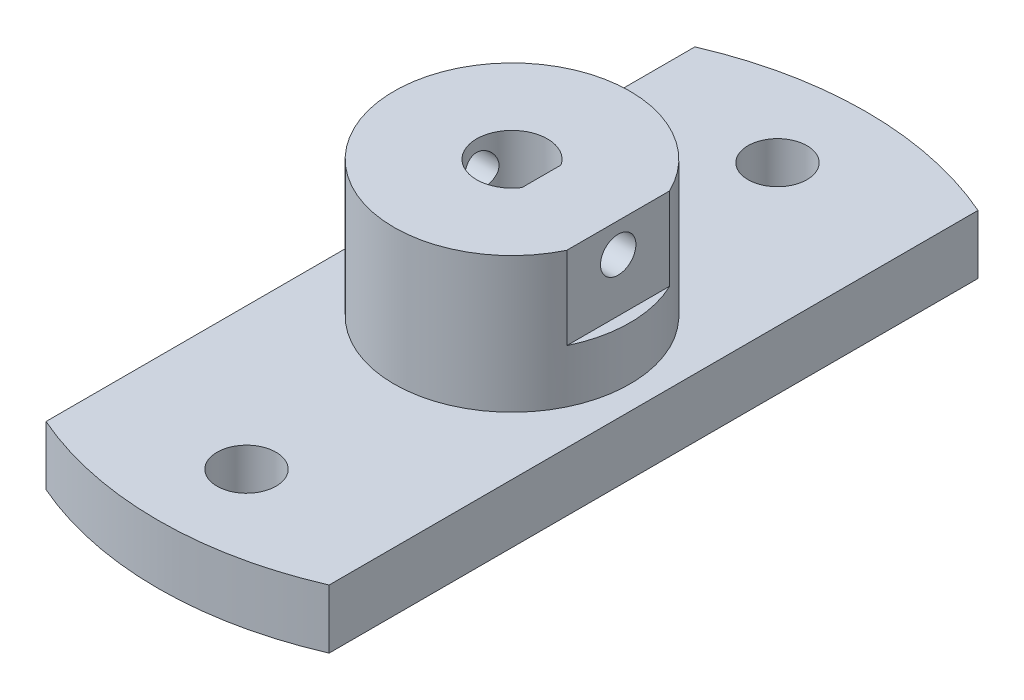
ISO-10303-21;
HEADER;
FILE_DESCRIPTION(('STEP AP214'),'2;1');
FILE_NAME('part.step','',(''),(''),'','','');
FILE_SCHEMA(('AUTOMOTIVE_DESIGN { 1 0 10303 214 1 1 1 1 }'));
ENDSEC;
DATA;
#1=APPLICATION_CONTEXT('core data for automotive mechanical design processes');
#2=APPLICATION_PROTOCOL_DEFINITION('international standard','automotive_design',2000,#1);
#3=PRODUCT_CONTEXT('',#1,'mechanical');
#4=PRODUCT('Part','Part','',(#3));
#5=PRODUCT_RELATED_PRODUCT_CATEGORY('part','',(#4));
#6=PRODUCT_DEFINITION_FORMATION('','',#4);
#7=PRODUCT_DEFINITION_CONTEXT('part definition',#1,'design');
#8=PRODUCT_DEFINITION('design','',#6,#7);
#9=PRODUCT_DEFINITION_SHAPE('','',#8);
#10=(LENGTH_UNIT() NAMED_UNIT(*) SI_UNIT(.MILLI.,.METRE.));
#11=(NAMED_UNIT(*) PLANE_ANGLE_UNIT() SI_UNIT($,.RADIAN.));
#12=(NAMED_UNIT(*) SI_UNIT($,.STERADIAN.) SOLID_ANGLE_UNIT());
#13=UNCERTAINTY_MEASURE_WITH_UNIT(LENGTH_MEASURE(1.E-05),#10,'distance_accuracy_value','');
#14=(GEOMETRIC_REPRESENTATION_CONTEXT(3) GLOBAL_UNCERTAINTY_ASSIGNED_CONTEXT((#13)) GLOBAL_UNIT_ASSIGNED_CONTEXT((#10,
#11,#12)) REPRESENTATION_CONTEXT('',''));
#15=CARTESIAN_POINT('',(0.,0.,0.));
#16=DIRECTION('',(0.,0.,1.));
#17=DIRECTION('',(1.,0.,0.));
#18=AXIS2_PLACEMENT_3D('',#15,#16,#17);
#19=CARTESIAN_POINT('',(0.,5.,0.));
#20=DIRECTION('',(0.,1.,0.));
#21=DIRECTION('',(0.,0.,1.));
#22=AXIS2_PLACEMENT_3D('',#19,#20,#21);
#23=PLANE('',#22);
#24=CARTESIAN_POINT('',(0.,5.,0.));
#25=DIRECTION('',(0.,1.,0.));
#26=DIRECTION('',(0.,0.,1.));
#27=AXIS2_PLACEMENT_3D('',#24,#25,#26);
#28=CIRCLE('',#27,10.);
#29=CARTESIAN_POINT('',(0.,5.,10.));
#30=VERTEX_POINT('',#29);
#31=EDGE_CURVE('E136',#30,#30,#28,.T.);
#32=ORIENTED_EDGE('',*,*,#31,.F.);
#33=EDGE_LOOP('',(#32));
#34=FACE_BOUND('',#33,.T.);
#35=CARTESIAN_POINT('',(0.,5.,-22.5));
#36=DIRECTION('',(0.,1.,0.));
#37=DIRECTION('',(0.,0.,1.));
#38=AXIS2_PLACEMENT_3D('',#35,#36,#37);
#39=CIRCLE('',#38,2.5);
#40=CARTESIAN_POINT('',(0.,5.,-20.));
#41=VERTEX_POINT('',#40);
#42=EDGE_CURVE('E150',#41,#41,#39,.T.);
#43=ORIENTED_EDGE('',*,*,#42,.F.);
#44=EDGE_LOOP('',(#43));
#45=FACE_BOUND('',#44,.T.);
#46=CARTESIAN_POINT('',(0.,5.,0.));
#47=DIRECTION('',(0.,1.,0.));
#48=DIRECTION('',(0.,0.,1.));
#49=AXIS2_PLACEMENT_3D('',#46,#47,#48);
#50=CIRCLE('',#49,30.);
#51=CARTESIAN_POINT('',(-12.,5.,27.495454169735));
#52=VERTEX_POINT('',#51);
#53=CARTESIAN_POINT('',(12.,5.,27.495454169735));
#54=VERTEX_POINT('',#53);
#55=EDGE_CURVE('E156',#52,#54,#50,.T.);
#56=ORIENTED_EDGE('',*,*,#55,.T.);
#57=DIRECTION('',(0.,0.,-1.));
#58=VECTOR('',#57,1.);
#59=CARTESIAN_POINT('',(12.,5.,-27.495454169735));
#60=LINE('',#59,#58);
#61=CARTESIAN_POINT('',(12.,5.,-27.495454169735));
#62=VERTEX_POINT('',#61);
#63=EDGE_CURVE('E159',#54,#62,#60,.T.);
#64=ORIENTED_EDGE('',*,*,#63,.T.);
#65=CARTESIAN_POINT('',(0.,5.,0.));
#66=DIRECTION('',(0.,1.,0.));
#67=DIRECTION('',(0.,0.,1.));
#68=AXIS2_PLACEMENT_3D('',#65,#66,#67);
#69=CIRCLE('',#68,30.);
#70=CARTESIAN_POINT('',(-12.,5.,-27.495454169735));
#71=VERTEX_POINT('',#70);
#72=EDGE_CURVE('E162',#62,#71,#69,.T.);
#73=ORIENTED_EDGE('',*,*,#72,.T.);
#74=DIRECTION('',(0.,0.,1.));
#75=VECTOR('',#74,1.);
#76=CARTESIAN_POINT('',(-12.,5.,-27.495454169735));
#77=LINE('',#76,#75);
#78=EDGE_CURVE('E164',#71,#52,#77,.T.);
#79=ORIENTED_EDGE('',*,*,#78,.T.);
#80=EDGE_LOOP('',(#56,#64,#73,#79));
#81=FACE_BOUND('',#80,.T.);
#82=CARTESIAN_POINT('',(0.,5.,22.5));
#83=DIRECTION('',(0.,1.,0.));
#84=DIRECTION('',(0.,0.,1.));
#85=AXIS2_PLACEMENT_3D('',#82,#83,#84);
#86=CIRCLE('',#85,2.5);
#87=CARTESIAN_POINT('',(0.,5.,25.));
#88=VERTEX_POINT('',#87);
#89=EDGE_CURVE('E144',#88,#88,#86,.T.);
#90=ORIENTED_EDGE('',*,*,#89,.F.);
#91=EDGE_LOOP('',(#90));
#92=FACE_BOUND('',#91,.T.);
#93=ADVANCED_FACE('F35',(#34,#45,#81,#92),#23,.T.);
#94=CARTESIAN_POINT('',(0.,0.,0.));
#95=DIRECTION('',(0.,1.,0.));
#96=DIRECTION('',(0.,0.,1.));
#97=AXIS2_PLACEMENT_3D('',#94,#95,#96);
#98=PLANE('',#97);
#99=CARTESIAN_POINT('',(0.,0.,0.));
#100=DIRECTION('',(0.,1.,0.));
#101=DIRECTION('',(0.,0.,1.));
#102=AXIS2_PLACEMENT_3D('',#99,#100,#101);
#103=CIRCLE('',#102,3.);
#104=CARTESIAN_POINT('',(0.,0.,3.));
#105=VERTEX_POINT('',#104);
#106=EDGE_CURVE('E116',#105,#105,#103,.T.);
#107=ORIENTED_EDGE('',*,*,#106,.T.);
#108=EDGE_LOOP('',(#107));
#109=FACE_BOUND('',#108,.T.);
#110=CARTESIAN_POINT('',(0.,0.,0.));
#111=DIRECTION('',(0.,1.,0.));
#112=DIRECTION('',(0.,0.,1.));
#113=AXIS2_PLACEMENT_3D('',#110,#111,#112);
#114=CIRCLE('',#113,30.);
#115=CARTESIAN_POINT('',(-12.,0.,27.495454169735));
#116=VERTEX_POINT('',#115);
#117=CARTESIAN_POINT('',(12.,0.,27.495454169735));
#118=VERTEX_POINT('',#117);
#119=EDGE_CURVE('E153',#116,#118,#114,.T.);
#120=ORIENTED_EDGE('',*,*,#119,.F.);
#121=DIRECTION('',(0.,0.,1.));
#122=VECTOR('',#121,1.);
#123=CARTESIAN_POINT('',(-12.,0.,-27.495454169735));
#124=LINE('',#123,#122);
#125=CARTESIAN_POINT('',(-12.,0.,-27.495454169735));
#126=VERTEX_POINT('',#125);
#127=EDGE_CURVE('E160',#126,#116,#124,.T.);
#128=ORIENTED_EDGE('',*,*,#127,.F.);
#129=CARTESIAN_POINT('',(0.,0.,0.));
#130=DIRECTION('',(0.,1.,0.));
#131=DIRECTION('',(0.,0.,1.));
#132=AXIS2_PLACEMENT_3D('',#129,#130,#131);
#133=CIRCLE('',#132,30.);
#134=CARTESIAN_POINT('',(12.,0.,-27.495454169735));
#135=VERTEX_POINT('',#134);
#136=EDGE_CURVE('E171',#135,#126,#133,.T.);
#137=ORIENTED_EDGE('',*,*,#136,.F.);
#138=DIRECTION('',(0.,0.,-1.));
#139=VECTOR('',#138,1.);
#140=CARTESIAN_POINT('',(12.,0.,-27.495454169735));
#141=LINE('',#140,#139);
#142=EDGE_CURVE('E169',#118,#135,#141,.T.);
#143=ORIENTED_EDGE('',*,*,#142,.F.);
#144=EDGE_LOOP('',(#120,#128,#137,#143));
#145=FACE_BOUND('',#144,.T.);
#146=CARTESIAN_POINT('',(0.,0.,-22.5));
#147=DIRECTION('',(0.,1.,0.));
#148=DIRECTION('',(0.,0.,1.));
#149=AXIS2_PLACEMENT_3D('',#146,#147,#148);
#150=CIRCLE('',#149,2.5);
#151=CARTESIAN_POINT('',(0.,0.,-20.));
#152=VERTEX_POINT('',#151);
#153=EDGE_CURVE('E147',#152,#152,#150,.T.);
#154=ORIENTED_EDGE('',*,*,#153,.T.);
#155=EDGE_LOOP('',(#154));
#156=FACE_BOUND('',#155,.T.);
#157=CARTESIAN_POINT('',(0.,0.,22.5));
#158=DIRECTION('',(0.,1.,0.));
#159=DIRECTION('',(0.,0.,1.));
#160=AXIS2_PLACEMENT_3D('',#157,#158,#159);
#161=CIRCLE('',#160,2.5);
#162=CARTESIAN_POINT('',(0.,0.,25.));
#163=VERTEX_POINT('',#162);
#164=EDGE_CURVE('E141',#163,#163,#161,.T.);
#165=ORIENTED_EDGE('',*,*,#164,.T.);
#166=EDGE_LOOP('',(#165));
#167=FACE_BOUND('',#166,.T.);
#168=ADVANCED_FACE('F233',(#109,#145,#156,#167),#98,.F.);
#169=CARTESIAN_POINT('',(0.,5.,0.));
#170=DIRECTION('',(0.,-1.,0.));
#171=DIRECTION('',(0.,0.,-1.));
#172=AXIS2_PLACEMENT_3D('',#169,#170,#171);
#173=CYLINDRICAL_SURFACE('',#172,30.);
#174=ORIENTED_EDGE('',*,*,#119,.T.);
#175=DIRECTION('',(0.,-1.,0.));
#176=VECTOR('',#175,1.);
#177=CARTESIAN_POINT('',(12.,5.,27.495454169735));
#178=LINE('',#177,#176);
#179=EDGE_CURVE('E11',#54,#118,#178,.T.);
#180=ORIENTED_EDGE('',*,*,#179,.F.);
#181=ORIENTED_EDGE('',*,*,#55,.F.);
#182=DIRECTION('',(0.,-1.,0.));
#183=VECTOR('',#182,1.);
#184=CARTESIAN_POINT('',(-12.,5.,27.495454169735));
#185=LINE('',#184,#183);
#186=EDGE_CURVE('E166',#52,#116,#185,.T.);
#187=ORIENTED_EDGE('',*,*,#186,.T.);
#188=EDGE_LOOP('',(#174,#180,#181,#187));
#189=FACE_BOUND('',#188,.T.);
#190=ADVANCED_FACE('F37',(#189),#173,.T.);
#191=CARTESIAN_POINT('',(12.,5.,-27.495454169735));
#192=DIRECTION('',(-1.,0.,0.));
#193=DIRECTION('',(0.,0.,1.));
#194=AXIS2_PLACEMENT_3D('',#191,#192,#193);
#195=PLANE('',#194);
#196=ORIENTED_EDGE('',*,*,#142,.T.);
#197=DIRECTION('',(0.,-1.,0.));
#198=VECTOR('',#197,1.);
#199=CARTESIAN_POINT('',(12.,5.,-27.495454169735));
#200=LINE('',#199,#198);
#201=EDGE_CURVE('E44',#62,#135,#200,.T.);
#202=ORIENTED_EDGE('',*,*,#201,.F.);
#203=ORIENTED_EDGE('',*,*,#63,.F.);
#204=ORIENTED_EDGE('',*,*,#179,.T.);
#205=EDGE_LOOP('',(#196,#202,#203,#204));
#206=FACE_BOUND('',#205,.T.);
#207=ADVANCED_FACE('F251',(#206),#195,.F.);
#208=CARTESIAN_POINT('',(0.,5.,0.));
#209=DIRECTION('',(0.,-1.,0.));
#210=DIRECTION('',(0.,0.,-1.));
#211=AXIS2_PLACEMENT_3D('',#208,#209,#210);
#212=CYLINDRICAL_SURFACE('',#211,30.);
#213=ORIENTED_EDGE('',*,*,#136,.T.);
#214=DIRECTION('',(0.,-1.,0.));
#215=VECTOR('',#214,1.);
#216=CARTESIAN_POINT('',(-12.,5.,-27.495454169735));
#217=LINE('',#216,#215);
#218=EDGE_CURVE('E176',#71,#126,#217,.T.);
#219=ORIENTED_EDGE('',*,*,#218,.F.);
#220=ORIENTED_EDGE('',*,*,#72,.F.);
#221=ORIENTED_EDGE('',*,*,#201,.T.);
#222=EDGE_LOOP('',(#213,#219,#220,#221));
#223=FACE_BOUND('',#222,.T.);
#224=ADVANCED_FACE('F248',(#223),#212,.T.);
#225=CARTESIAN_POINT('',(-12.,5.,-27.495454169735));
#226=DIRECTION('',(1.,0.,0.));
#227=DIRECTION('',(0.,0.,-1.));
#228=AXIS2_PLACEMENT_3D('',#225,#226,#227);
#229=PLANE('',#228);
#230=ORIENTED_EDGE('',*,*,#127,.T.);
#231=ORIENTED_EDGE('',*,*,#186,.F.);
#232=ORIENTED_EDGE('',*,*,#78,.F.);
#233=ORIENTED_EDGE('',*,*,#218,.T.);
#234=EDGE_LOOP('',(#230,#231,#232,#233));
#235=FACE_BOUND('',#234,.T.);
#236=ADVANCED_FACE('F245',(#235),#229,.F.);
#237=CARTESIAN_POINT('',(0.,5.,-22.5));
#238=DIRECTION('',(0.,-1.,0.));
#239=DIRECTION('',(0.,0.,-1.));
#240=AXIS2_PLACEMENT_3D('',#237,#238,#239);
#241=CYLINDRICAL_SURFACE('',#240,2.5);
#242=ORIENTED_EDGE('',*,*,#42,.T.);
#243=EDGE_LOOP('',(#242));
#244=FACE_BOUND('',#243,.T.);
#245=ORIENTED_EDGE('',*,*,#153,.F.);
#246=EDGE_LOOP('',(#245));
#247=FACE_BOUND('',#246,.T.);
#248=ADVANCED_FACE('F243',(#244,#247),#241,.F.);
#249=CARTESIAN_POINT('',(0.,5.,22.5));
#250=DIRECTION('',(0.,-1.,0.));
#251=DIRECTION('',(0.,0.,-1.));
#252=AXIS2_PLACEMENT_3D('',#249,#250,#251);
#253=CYLINDRICAL_SURFACE('',#252,2.5);
#254=ORIENTED_EDGE('',*,*,#89,.T.);
#255=EDGE_LOOP('',(#254));
#256=FACE_BOUND('',#255,.T.);
#257=ORIENTED_EDGE('',*,*,#164,.F.);
#258=EDGE_LOOP('',(#257));
#259=FACE_BOUND('',#258,.T.);
#260=ADVANCED_FACE('F229',(#256,#259),#253,.F.);
#261=CARTESIAN_POINT('',(0.,16.5,0.));
#262=DIRECTION('',(0.,-1.,0.));
#263=DIRECTION('',(0.,0.,-1.));
#264=AXIS2_PLACEMENT_3D('',#261,#262,#263);
#265=CYLINDRICAL_SURFACE('',#264,10.);
#266=CARTESIAN_POINT('',(-9.88685996664259,14.,-1.5));
#267=CARTESIAN_POINT('',(-9.88686136668593,14.08374556929,-1.49999654107284));
#268=CARTESIAN_POINT('',(-9.88793551739101,14.1675397507507,-1.49296296388491));
#269=CARTESIAN_POINT('',(-9.8921131480324,14.3327853148831,-1.46502196657001));
#270=CARTESIAN_POINT('',(-9.8952186073143,14.41423433148,-1.44410101402628));
#271=CARTESIAN_POINT('',(-9.90309938986228,14.5723737554469,-1.38902526098084));
#272=CARTESIAN_POINT('',(-9.90787343131536,14.6490677625422,-1.35488061681397));
#273=CARTESIAN_POINT('',(-9.91855194113145,14.7956270307721,-1.27435063087791));
#274=CARTESIAN_POINT('',(-9.92445625383668,14.8654932302143,-1.22796697429872));
#275=CARTESIAN_POINT('',(-9.9367828924804,14.9969838167543,-1.12387902418559));
#276=CARTESIAN_POINT('',(-9.94320862458057,15.0585456134067,-1.0660960558482));
#277=CARTESIAN_POINT('',(-9.95582368169047,15.1711374856555,-0.941019605444376));
#278=CARTESIAN_POINT('',(-9.96201299368615,15.222166982167,-0.873725600786531));
#279=CARTESIAN_POINT('',(-9.97349347428185,15.3124766316914,-0.731136358052746));
#280=CARTESIAN_POINT('',(-9.97878018435569,15.3516991503225,-0.655804227365768));
#281=CARTESIAN_POINT('',(-9.98782206746405,15.4169115988082,-0.499528850106976));
#282=CARTESIAN_POINT('',(-9.99157732141945,15.4429022278429,-0.418585900270678));
#283=CARTESIAN_POINT('',(-9.99710914797782,15.4807233885308,-0.254031123090571));
#284=CARTESIAN_POINT('',(-9.99890035887344,15.4926587263872,-0.170443884389868));
#285=CARTESIAN_POINT('',(-10.0003524476958,15.5023559348249,-0.00243520401948052));
#286=CARTESIAN_POINT('',(-10.0000134440494,15.5001185933197,0.0819861910157448));
#287=CARTESIAN_POINT('',(-9.99725499660796,15.4816166622376,0.248551718200518));
#288=CARTESIAN_POINT('',(-9.99485227652479,15.4654648282085,0.330708691400006));
#289=CARTESIAN_POINT('',(-9.98825500227851,15.4197693936774,0.491132829143136));
#290=CARTESIAN_POINT('',(-9.98406040199739,15.3902254484986,0.56939989351348));
#291=CARTESIAN_POINT('',(-9.97432193873206,15.3184690030829,0.720163780770315));
#292=CARTESIAN_POINT('',(-9.96877303515638,15.2762090348913,0.792637672323595));
#293=CARTESIAN_POINT('',(-9.95694438245421,15.18025480633,0.929507907150176));
#294=CARTESIAN_POINT('',(-9.95066458523184,15.1265597932931,0.993903718271734));
#295=CARTESIAN_POINT('',(-9.93800158192627,15.0086315511734,1.11345448272264));
#296=CARTESIAN_POINT('',(-9.93161796623257,14.9442998780299,1.16851232950947));
#297=CARTESIAN_POINT('',(-9.91952704453523,14.8072589228763,1.26706599338813));
#298=CARTESIAN_POINT('',(-9.91381974269649,14.7345495892801,1.31056173927999));
#299=CARTESIAN_POINT('',(-9.90372775286855,14.5827160370594,1.38476964534605));
#300=CARTESIAN_POINT('',(-9.89934409845291,14.5035868663376,1.41547182270081));
#301=CARTESIAN_POINT('',(-9.89241402899059,14.3412147448526,1.46312336208879));
#302=CARTESIAN_POINT('',(-9.88986748446299,14.2579720844532,1.48007369337326));
#303=CARTESIAN_POINT('',(-9.88692451395027,14.0905999104225,1.49960720086655));
#304=CARTESIAN_POINT('',(-9.88650748802574,14.0064868117985,1.50232803265052));
#305=CARTESIAN_POINT('',(-9.88781607937153,13.8390058051827,1.49369057019819));
#306=CARTESIAN_POINT('',(-9.88954163015778,13.7556378741492,1.48233271282302));
#307=CARTESIAN_POINT('',(-9.89492202461453,13.5924401820344,1.44597702952766));
#308=CARTESIAN_POINT('',(-9.89856716482858,13.5125947950584,1.42104778527821));
#309=CARTESIAN_POINT('',(-9.90736801825768,13.3582159079514,1.35832831947087));
#310=CARTESIAN_POINT('',(-9.91252380607176,13.2836826703718,1.32053746276389));
#311=CARTESIAN_POINT('',(-9.92381355687063,13.141426739665,1.23283677995323));
#312=CARTESIAN_POINT('',(-9.92995459279988,13.0737595527202,1.18283784561766));
#313=CARTESIAN_POINT('',(-9.94250159433355,12.9477271401262,1.07226416837201));
#314=CARTESIAN_POINT('',(-9.94890757490292,12.8893624408188,1.01168882744679));
#315=CARTESIAN_POINT('',(-9.96132705217386,12.7830973933664,0.881075619628182));
#316=CARTESIAN_POINT('',(-9.96733683460423,12.7352882717575,0.810963126771956));
#317=CARTESIAN_POINT('',(-9.97822905032016,12.6521270947374,0.66362208026368));
#318=CARTESIAN_POINT('',(-9.98311151444563,12.616774698535,0.586393721360437));
#319=CARTESIAN_POINT('',(-9.99118269660795,12.559676257512,0.427297995861145));
#320=CARTESIAN_POINT('',(-9.99437761717899,12.5378803329216,0.345448858754301));
#321=CARTESIAN_POINT('',(-9.99873976656896,12.5083521204625,0.179200815501192));
#322=CARTESIAN_POINT('',(-9.99990712930801,12.5006189037509,0.0948020781305799));
#323=CARTESIAN_POINT('',(-10.0000812905914,12.4994582954506,-0.0732645908608192));
#324=CARTESIAN_POINT('',(-9.99910917023796,12.505891319123,-0.156931570212053));
#325=CARTESIAN_POINT('',(-9.99515610519141,12.5325813884208,-0.321979795323108));
#326=CARTESIAN_POINT('',(-9.99217516692666,12.5528383898086,-0.403361048396513));
#327=CARTESIAN_POINT('',(-9.98453786742463,12.6065518755702,-0.561489374379661));
#328=CARTESIAN_POINT('',(-9.97988273316947,12.6399986951389,-0.638239793148783));
#329=CARTESIAN_POINT('',(-9.96940834495499,12.7191274879831,-0.785061117896603));
#330=CARTESIAN_POINT('',(-9.96358905320338,12.7648098584803,-0.85513180692071));
#331=CARTESIAN_POINT('',(-9.95136510636178,12.8676176988292,-0.98731258519196));
#332=CARTESIAN_POINT('',(-9.94495548425942,12.9248462258163,-1.04934206644638));
#333=CARTESIAN_POINT('',(-9.93231001689001,13.0489050730805,-1.16296808390268));
#334=CARTESIAN_POINT('',(-9.92607421276291,13.1157376438243,-1.21456216798984));
#335=CARTESIAN_POINT('',(-9.91444484029116,13.2575489832325,-1.30611310822974));
#336=CARTESIAN_POINT('',(-9.90905620156985,13.3325714170218,-1.34600294291209));
#337=CARTESIAN_POINT('',(-9.89978909110724,13.4882967767633,-1.41255613872045));
#338=CARTESIAN_POINT('',(-9.89590905307931,13.5689937078578,-1.43923322574898));
#339=CARTESIAN_POINT('',(-9.89099485524825,13.7083774362565,-1.47254951890026));
#340=CARTESIAN_POINT('',(-9.88945249382379,13.7662033969243,-1.4828276978042));
#341=CARTESIAN_POINT('',(-9.88738456567011,13.8826782917343,-1.49655410576574));
#342=CARTESIAN_POINT('',(-9.88685898576155,13.9413272151996,-1.50000242335076));
#343=CARTESIAN_POINT('',(-9.88685996664259,14.,-1.5));
#344=B_SPLINE_CURVE_WITH_KNOTS('',3,(#266,#267,#268,#269,#270,#271,#272,#273,#274,#275,#276,
#277,#278,#279,#280,#281,#282,#283,#284,#285,#286,#287,#288,#289,#290,#291,#292,#293,#294,#295,
#296,#297,#298,#299,#300,#301,#302,#303,#304,#305,#306,#307,#308,#309,#310,#311,#312,#313,#314,
#315,#316,#317,#318,#319,#320,#321,#322,#323,#324,#325,#326,#327,#328,#329,#330,#331,#332,#333,
#334,#335,#336,#337,#338,#339,#340,#341,#342,#343),.UNSPECIFIED.,.T.,.F.,(4,2,2,2,2,2,2,2,2,2,2,
2,2,2,2,2,2,2,2,2,2,2,2,2,2,2,2,2,2,2,2,2,2,2,2,2,2,2,4),(0.,0.251022251804867,
0.502289469561802,0.753364085335674,1.00440414866132,1.25724158649107,1.51009292207817,
1.76415922105782,2.018212093645,2.27035832534397,2.52249053939374,2.77259862515728,
3.02271314839401,3.27377316386453,3.52484970949272,3.77839544666269,4.0319427451435,
4.28568751773139,4.53941440444341,4.79068214603744,5.04194209099918,5.29194394807374,
5.54195815286117,5.79385486001302,6.04576581461801,6.29977537753516,6.55377799071854,
6.8068404089109,7.05988611170473,7.31044963622326,7.56101235892823,7.81139182257833,
8.06177941567106,8.31450950010969,8.56729890236862,8.82150878824931,9.07545403445563,
9.25132441891613,9.42719252376192),.UNSPECIFIED.);
#345=CARTESIAN_POINT('',(-9.88685996664259,14.,-1.5));
#346=VERTEX_POINT('',#345);
#347=EDGE_CURVE('E117',#346,#346,#344,.T.);
#348=ORIENTED_EDGE('',*,*,#347,.T.);
#349=EDGE_LOOP('',(#348));
#350=FACE_BOUND('',#349,.T.);
#351=CARTESIAN_POINT('',(0.,16.5,0.));
#352=DIRECTION('',(0.,1.,0.));
#353=DIRECTION('',(0.,0.,1.));
#354=AXIS2_PLACEMENT_3D('',#351,#352,#353);
#355=CIRCLE('',#354,10.);
#356=CARTESIAN_POINT('',(9.,16.5,-4.35889894354067));
#357=VERTEX_POINT('',#356);
#358=CARTESIAN_POINT('',(9.,16.5,4.35889894354067));
#359=VERTEX_POINT('',#358);
#360=EDGE_CURVE('E138',#357,#359,#355,.T.);
#361=ORIENTED_EDGE('',*,*,#360,.F.);
#362=DIRECTION('',(0.,1.,0.));
#363=VECTOR('',#362,1.);
#364=CARTESIAN_POINT('',(9.,9.5,-4.35889894354068));
#365=LINE('',#364,#363);
#366=CARTESIAN_POINT('',(9.,9.5,-4.35889894354068));
#367=VERTEX_POINT('',#366);
#368=EDGE_CURVE('E60',#367,#357,#365,.T.);
#369=ORIENTED_EDGE('',*,*,#368,.F.);
#370=CARTESIAN_POINT('',(0.,9.5,0.));
#371=DIRECTION('',(0.,1.,0.));
#372=DIRECTION('',(0.,0.,1.));
#373=AXIS2_PLACEMENT_3D('',#370,#371,#372);
#374=CIRCLE('',#373,10.);
#375=CARTESIAN_POINT('',(9.,9.5,4.35889894354067));
#376=VERTEX_POINT('',#375);
#377=EDGE_CURVE('E123',#376,#367,#374,.T.);
#378=ORIENTED_EDGE('',*,*,#377,.F.);
#379=DIRECTION('',(0.,1.,0.));
#380=VECTOR('',#379,1.);
#381=CARTESIAN_POINT('',(9.,9.5,4.35889894354067));
#382=LINE('',#381,#380);
#383=EDGE_CURVE('E133',#376,#359,#382,.T.);
#384=ORIENTED_EDGE('',*,*,#383,.T.);
#385=EDGE_LOOP('',(#361,#369,#378,#384));
#386=FACE_BOUND('',#385,.T.);
#387=ORIENTED_EDGE('',*,*,#31,.T.);
#388=EDGE_LOOP('',(#387));
#389=FACE_BOUND('',#388,.T.);
#390=ADVANCED_FACE('F197',(#350,#386,#389),#265,.T.);
#391=CARTESIAN_POINT('',(0.,16.5,0.));
#392=DIRECTION('',(0.,1.,0.));
#393=DIRECTION('',(0.,0.,1.));
#394=AXIS2_PLACEMENT_3D('',#391,#392,#393);
#395=PLANE('',#394);
#396=CARTESIAN_POINT('',(0.,16.5,0.));
#397=DIRECTION('',(0.,1.,0.));
#398=DIRECTION('',(0.,0.,1.));
#399=AXIS2_PLACEMENT_3D('',#396,#397,#398);
#400=CIRCLE('',#399,3.);
#401=CARTESIAN_POINT('',(2.5,16.5,-1.6583123951777));
#402=VERTEX_POINT('',#401);
#403=CARTESIAN_POINT('',(2.5,16.5,1.6583123951777));
#404=VERTEX_POINT('',#403);
#405=EDGE_CURVE('E52',#402,#404,#400,.T.);
#406=ORIENTED_EDGE('',*,*,#405,.F.);
#407=DIRECTION('',(0.,0.,-1.));
#408=VECTOR('',#407,1.);
#409=CARTESIAN_POINT('',(2.5,16.5,-1.6583123951777));
#410=LINE('',#409,#408);
#411=EDGE_CURVE('E110',#404,#402,#410,.T.);
#412=ORIENTED_EDGE('',*,*,#411,.F.);
#413=EDGE_LOOP('',(#406,#412));
#414=FACE_BOUND('',#413,.T.);
#415=DIRECTION('',(0.,0.,1.));
#416=VECTOR('',#415,1.);
#417=CARTESIAN_POINT('',(9.,16.5,-4.35889894354068));
#418=LINE('',#417,#416);
#419=EDGE_CURVE('E121',#357,#359,#418,.T.);
#420=ORIENTED_EDGE('',*,*,#419,.F.);
#421=ORIENTED_EDGE('',*,*,#360,.T.);
#422=EDGE_LOOP('',(#420,#421));
#423=FACE_BOUND('',#422,.T.);
#424=ADVANCED_FACE('F222',(#414,#423),#395,.T.);
#425=CARTESIAN_POINT('',(9.,9.5,-4.35889894354068));
#426=DIRECTION('',(-1.,0.,0.));
#427=DIRECTION('',(0.,0.,1.));
#428=AXIS2_PLACEMENT_3D('',#425,#426,#427);
#429=PLANE('',#428);
#430=CARTESIAN_POINT('',(9.,14.,0.));
#431=DIRECTION('',(1.,0.,0.));
#432=DIRECTION('',(0.,0.,-1.));
#433=AXIS2_PLACEMENT_3D('',#430,#431,#432);
#434=CIRCLE('',#433,1.5);
#435=CARTESIAN_POINT('',(9.,14.,-1.5));
#436=VERTEX_POINT('',#435);
#437=EDGE_CURVE('E370',#436,#436,#434,.T.);
#438=ORIENTED_EDGE('',*,*,#437,.F.);
#439=EDGE_LOOP('',(#438));
#440=FACE_BOUND('',#439,.T.);
#441=ORIENTED_EDGE('',*,*,#419,.T.);
#442=ORIENTED_EDGE('',*,*,#383,.F.);
#443=DIRECTION('',(0.,0.,1.));
#444=VECTOR('',#443,1.);
#445=CARTESIAN_POINT('',(9.,9.5,-4.35889894354068));
#446=LINE('',#445,#444);
#447=EDGE_CURVE('E130',#367,#376,#446,.T.);
#448=ORIENTED_EDGE('',*,*,#447,.F.);
#449=ORIENTED_EDGE('',*,*,#368,.T.);
#450=EDGE_LOOP('',(#441,#442,#448,#449));
#451=FACE_BOUND('',#450,.T.);
#452=ADVANCED_FACE('F219',(#440,#451),#429,.F.);
#453=CARTESIAN_POINT('',(0.,9.5,0.));
#454=DIRECTION('',(0.,1.,0.));
#455=DIRECTION('',(0.,0.,1.));
#456=AXIS2_PLACEMENT_3D('',#453,#454,#455);
#457=PLANE('',#456);
#458=ORIENTED_EDGE('',*,*,#377,.T.);
#459=ORIENTED_EDGE('',*,*,#447,.T.);
#460=EDGE_LOOP('',(#458,#459));
#461=FACE_BOUND('',#460,.T.);
#462=ADVANCED_FACE('F215',(#461),#457,.T.);
#463=CARTESIAN_POINT('',(0.,5.,0.));
#464=DIRECTION('',(0.,1.,0.));
#465=DIRECTION('',(0.,0.,1.));
#466=AXIS2_PLACEMENT_3D('',#463,#464,#465);
#467=CYLINDRICAL_SURFACE('',#466,3.);
#468=CARTESIAN_POINT('',(-2.59807621135332,14.,-1.5));
#469=CARTESIAN_POINT('',(-2.59808302092689,13.9218382877071,-1.4999945446118));
#470=CARTESIAN_POINT('',(-2.60165701781635,13.8435778827124,-1.49384995609983));
#471=CARTESIAN_POINT('',(-2.61543549678079,13.6894591029843,-1.46958481484708));
#472=CARTESIAN_POINT('',(-2.62565391083339,13.6136061274349,-1.45143909683127));
#473=CARTESIAN_POINT('',(-2.65124019908098,13.4668225034841,-1.40414992304972));
#474=CARTESIAN_POINT('',(-2.66658065209878,13.3958680212896,-1.3750649287406));
#475=CARTESIAN_POINT('',(-2.70063997225287,13.2598636970049,-1.30690128806456));
#476=CARTESIAN_POINT('',(-2.71935902214097,13.1948141746063,-1.26782210105366));
#477=CARTESIAN_POINT('',(-2.75995303586162,13.0665414071637,-1.17699981079632));
#478=CARTESIAN_POINT('',(-2.7819609545693,13.0039112964897,-1.12447805421566));
#479=CARTESIAN_POINT('',(-2.82557974178559,12.8878874173899,-1.0098807114217));
#480=CARTESIAN_POINT('',(-2.84719040746875,12.8344982561247,-0.947800388673441));
#481=CARTESIAN_POINT('',(-2.88932215429424,12.7349492732785,-0.810734345121821));
#482=CARTESIAN_POINT('',(-2.90967159627259,12.6895193482107,-0.735160783518865));
#483=CARTESIAN_POINT('',(-2.94526134149294,12.6122887201314,-0.576235539899259));
#484=CARTESIAN_POINT('',(-2.96050486775612,12.5804794157942,-0.492888807207235));
#485=CARTESIAN_POINT('',(-2.98320691866356,12.5337430080484,-0.327067415888968));
#486=CARTESIAN_POINT('',(-2.99114220331338,12.5177757104667,-0.244952685733228));
#487=CARTESIAN_POINT('',(-3.00011375769101,12.4997508219874,-0.0788559430467742));
#488=CARTESIAN_POINT('',(-3.00115420176885,12.4976848148064,0.00512490876560598));
#489=CARTESIAN_POINT('',(-2.99644472874675,12.5071200109555,0.164748786635623));
#490=CARTESIAN_POINT('',(-2.99127743838241,12.5174570232818,0.240481798765186));
#491=CARTESIAN_POINT('',(-2.97561367889621,12.549321265857,0.388970657877482));
#492=CARTESIAN_POINT('',(-2.96511681099591,12.5708493334643,0.461726281640887));
#493=CARTESIAN_POINT('',(-2.93957374931482,12.6246238491347,0.603464087354329));
#494=CARTESIAN_POINT('',(-2.92446662293799,12.6570144697581,0.672380135272767));
#495=CARTESIAN_POINT('',(-2.89106468980031,12.7313951243022,0.803965202269992));
#496=CARTESIAN_POINT('',(-2.87276874236226,12.7733885949535,0.866631973257967));
#497=CARTESIAN_POINT('',(-2.83266591598844,12.8703430272995,0.990260491347291));
#498=CARTESIAN_POINT('',(-2.81069063997263,12.926154542489,1.05050111254404));
#499=CARTESIAN_POINT('',(-2.76681510880218,13.0468845873953,1.16115655544667));
#500=CARTESIAN_POINT('',(-2.74491492398443,13.1118100584111,1.21156381736134));
#501=CARTESIAN_POINT('',(-2.70216234138727,13.2539722886361,1.30425800196332));
#502=CARTESIAN_POINT('',(-2.68146479986061,13.3317290345813,1.34582597246708));
#503=CARTESIAN_POINT('',(-2.64563175417864,13.4944065070385,1.41497866950185));
#504=CARTESIAN_POINT('',(-2.63049045069101,13.5793196495263,1.44257798731633));
#505=CARTESIAN_POINT('',(-2.60916953725552,13.7468217669242,1.48077031653756));
#506=CARTESIAN_POINT('',(-2.60237483772745,13.8290616785653,1.49253768317996));
#507=CARTESIAN_POINT('',(-2.59676879042414,13.9946020122748,1.50227541991714));
#508=CARTESIAN_POINT('',(-2.59795180333968,14.0779016436797,1.50025553597254));
#509=CARTESIAN_POINT('',(-2.60751504810877,14.2334808778681,1.48355406501595));
#510=CARTESIAN_POINT('',(-2.61509381259981,14.3059691766619,1.4702817250687));
#511=CARTESIAN_POINT('',(-2.63541032327012,14.4475516794064,1.43354442694866));
#512=CARTESIAN_POINT('',(-2.64814974007551,14.5166447761199,1.41007616793542));
#513=CARTESIAN_POINT('',(-2.67804333119485,14.653116996354,1.35247138290733));
#514=CARTESIAN_POINT('',(-2.69537464864595,14.7202685252803,1.31789109553908));
#515=CARTESIAN_POINT('',(-2.73234179245875,14.8482039073085,1.23943059602371));
#516=CARTESIAN_POINT('',(-2.75197880032722,14.9089844652699,1.19554560649832));
#517=CARTESIAN_POINT('',(-2.79431997684504,15.0304681512853,1.09325575079828));
#518=CARTESIAN_POINT('',(-2.81709874731434,15.0901957260765,1.03371790847245));
#519=CARTESIAN_POINT('',(-2.86101352466839,15.1991183569904,0.905106743097432));
#520=CARTESIAN_POINT('',(-2.88214897511564,15.2483098553458,0.83603021198302));
#521=CARTESIAN_POINT('',(-2.92112042536435,15.3358605889252,0.687803043838135));
#522=CARTESIAN_POINT('',(-2.93885462508044,15.3738996773164,0.608434646361169));
#523=CARTESIAN_POINT('',(-2.96825032438952,15.4357068557861,0.443283546961622));
#524=CARTESIAN_POINT('',(-2.9799171551456,15.4594874770495,0.357506552088263));
#525=CARTESIAN_POINT('',(-2.99501262272824,15.490052846262,0.190469523495624));
#526=CARTESIAN_POINT('',(-2.99909891862287,15.4981968138142,0.109517165775684));
#527=CARTESIAN_POINT('',(-3.00063195562697,15.5012648981816,-0.0526889789268069));
#528=CARTESIAN_POINT('',(-2.99808102100335,15.4961936427853,-0.133942650442632));
#529=CARTESIAN_POINT('',(-2.98700953256884,15.4738753898066,-0.288806988475722));
#530=CARTESIAN_POINT('',(-2.97889342001985,15.4574527261135,-0.362568476716897));
#531=CARTESIAN_POINT('',(-2.95788140495135,15.4140095010455,-0.506168928275428));
#532=CARTESIAN_POINT('',(-2.94498481699194,15.3869874198598,-0.576007327433264));
#533=CARTESIAN_POINT('',(-2.9148889612218,15.321909421751,-0.713135109367328));
#534=CARTESIAN_POINT('',(-2.89752925798199,15.2834310151882,-0.780187714050071));
#535=CARTESIAN_POINT('',(-2.86032199712739,15.1970631037114,-0.907161962721038));
#536=CARTESIAN_POINT('',(-2.84047329837541,15.1491692763265,-0.967080311122362));
#537=CARTESIAN_POINT('',(-2.79792915339941,15.0398042914659,-1.08437100623534));
#538=CARTESIAN_POINT('',(-2.77514698517547,14.9774562687842,-1.14089652680891));
#539=CARTESIAN_POINT('',(-2.73094614244279,14.8438239183053,-1.24299493109201));
#540=CARTESIAN_POINT('',(-2.70952868642798,14.7725317686985,-1.28855812501509));
#541=CARTESIAN_POINT('',(-2.66999407957374,14.6200450301286,-1.36864661967848));
#542=CARTESIAN_POINT('',(-2.65200261384405,14.5386087033069,-1.40277759894141));
#543=CARTESIAN_POINT('',(-2.62299234492527,14.3700013934903,-1.45631806425962));
#544=CARTESIAN_POINT('',(-2.61195024221553,14.282850666631,-1.47577678676302));
#545=CARTESIAN_POINT('',(-2.60293908902686,14.162291966522,-1.49155051179662));
#546=CARTESIAN_POINT('',(-2.60112193507728,14.1299481584032,-1.49471415744578));
#547=CARTESIAN_POINT('',(-2.59868903831625,14.0650752789766,-1.49894010763495));
#548=CARTESIAN_POINT('',(-2.59807337587664,14.0325461954212,-1.50000227159981));
#549=CARTESIAN_POINT('',(-2.59807621135332,14.,-1.5));
#550=B_SPLINE_CURVE_WITH_KNOTS('',3,(#468,#469,#470,#471,#472,#473,#474,#475,#476,#477,#478,
#479,#480,#481,#482,#483,#484,#485,#486,#487,#488,#489,#490,#491,#492,#493,#494,#495,#496,#497,
#498,#499,#500,#501,#502,#503,#504,#505,#506,#507,#508,#509,#510,#511,#512,#513,#514,#515,#516,
#517,#518,#519,#520,#521,#522,#523,#524,#525,#526,#527,#528,#529,#530,#531,#532,#533,#534,#535,
#536,#537,#538,#539,#540,#541,#542,#543,#544,#545,#546,#547,#548,#549),.UNSPECIFIED.,.T.,.F.,(4,
2,2,2,2,2,2,2,2,2,2,2,2,2,2,2,2,2,2,2,2,2,2,2,2,2,2,2,2,2,2,2,2,2,2,2,2,2,2,2,4),(0.,
0.234348183892073,0.469189339237207,0.702792893878329,0.936409088167724,1.18929346874735,
1.44230356626556,1.71236838358145,1.98226240445836,2.23295227451903,2.4834903552906,
2.71224146226808,2.94100968776183,3.1729430209672,3.40495949025408,3.65890787185336,
3.91305072368878,4.18333262594173,4.45333161317557,4.70193436281317,4.95036139782559,
5.17161275136038,5.39293578654094,5.62450944609131,5.85620229330071,6.1171011537092,
6.37808797467303,6.64596272119448,6.91360169713157,7.1566840558423,7.39968130190957,
7.62666637307239,7.85368400268019,8.09041126079208,8.32724745151078,8.58765362775101,
8.84828914267731,9.11716123557908,9.38512699504141,9.48270202777964,9.58028358741811),.UNSPECIFIED.);
#551=CARTESIAN_POINT('',(-2.59807621135332,14.,-1.5));
#552=VERTEX_POINT('',#551);
#553=EDGE_CURVE('E191',#552,#552,#550,.T.);
#554=ORIENTED_EDGE('',*,*,#553,.T.);
#555=EDGE_LOOP('',(#554));
#556=FACE_BOUND('',#555,.T.);
#557=ORIENTED_EDGE('',*,*,#405,.T.);
#558=DIRECTION('',(0.,1.,0.));
#559=VECTOR('',#558,1.);
#560=CARTESIAN_POINT('',(2.5,5.,1.6583123951777));
#561=LINE('',#560,#559);
#562=CARTESIAN_POINT('',(2.5,5.,1.6583123951777));
#563=VERTEX_POINT('',#562);
#564=EDGE_CURVE('E109',#563,#404,#561,.T.);
#565=ORIENTED_EDGE('',*,*,#564,.F.);
#566=CARTESIAN_POINT('',(0.,5.,0.));
#567=DIRECTION('',(0.,1.,0.));
#568=DIRECTION('',(0.,0.,1.));
#569=AXIS2_PLACEMENT_3D('',#566,#567,#568);
#570=CIRCLE('',#569,3.);
#571=CARTESIAN_POINT('',(2.5,5.,-1.6583123951777));
#572=VERTEX_POINT('',#571);
#573=EDGE_CURVE('E106',#563,#572,#570,.T.);
#574=ORIENTED_EDGE('',*,*,#573,.T.);
#575=DIRECTION('',(0.,1.,0.));
#576=VECTOR('',#575,1.);
#577=CARTESIAN_POINT('',(2.5,5.,-1.6583123951777));
#578=LINE('',#577,#576);
#579=EDGE_CURVE('E114',#572,#402,#578,.T.);
#580=ORIENTED_EDGE('',*,*,#579,.T.);
#581=EDGE_LOOP('',(#557,#565,#574,#580));
#582=FACE_BOUND('',#581,.T.);
#583=ORIENTED_EDGE('',*,*,#106,.F.);
#584=EDGE_LOOP('',(#583));
#585=FACE_BOUND('',#584,.T.);
#586=ADVANCED_FACE('F112',(#556,#582,#585),#467,.F.);
#587=CARTESIAN_POINT('',(2.5,5.,-1.6583123951777));
#588=DIRECTION('',(1.,0.,0.));
#589=DIRECTION('',(0.,0.,-1.));
#590=AXIS2_PLACEMENT_3D('',#587,#588,#589);
#591=PLANE('',#590);
#592=CARTESIAN_POINT('',(2.5,14.,0.));
#593=DIRECTION('',(1.,0.,0.));
#594=DIRECTION('',(0.,0.,-1.));
#595=AXIS2_PLACEMENT_3D('',#592,#593,#594);
#596=CIRCLE('',#595,1.5);
#597=CARTESIAN_POINT('',(2.5,14.,-1.5));
#598=VERTEX_POINT('',#597);
#599=EDGE_CURVE('E39',#598,#598,#596,.T.);
#600=ORIENTED_EDGE('',*,*,#599,.T.);
#601=EDGE_LOOP('',(#600));
#602=FACE_BOUND('',#601,.T.);
#603=ORIENTED_EDGE('',*,*,#411,.T.);
#604=ORIENTED_EDGE('',*,*,#579,.F.);
#605=DIRECTION('',(0.,0.,-1.));
#606=VECTOR('',#605,1.);
#607=CARTESIAN_POINT('',(2.5,5.,-1.6583123951777));
#608=LINE('',#607,#606);
#609=EDGE_CURVE('E103',#563,#572,#608,.T.);
#610=ORIENTED_EDGE('',*,*,#609,.F.);
#611=ORIENTED_EDGE('',*,*,#564,.T.);
#612=EDGE_LOOP('',(#603,#604,#610,#611));
#613=FACE_BOUND('',#612,.T.);
#614=ADVANCED_FACE('F119',(#602,#613),#591,.F.);
#615=CARTESIAN_POINT('',(0.,5.,0.));
#616=DIRECTION('',(0.,1.,0.));
#617=DIRECTION('',(0.,0.,1.));
#618=AXIS2_PLACEMENT_3D('',#615,#616,#617);
#619=PLANE('',#618);
#620=ORIENTED_EDGE('',*,*,#609,.T.);
#621=ORIENTED_EDGE('',*,*,#573,.F.);
#622=EDGE_LOOP('',(#620,#621));
#623=FACE_BOUND('',#622,.T.);
#624=ADVANCED_FACE('F105',(#623),#619,.F.);
#625=CARTESIAN_POINT('',(-12.,14.,0.));
#626=DIRECTION('',(1.,0.,0.));
#627=DIRECTION('',(0.,0.,-1.));
#628=AXIS2_PLACEMENT_3D('',#625,#626,#627);
#629=CYLINDRICAL_SURFACE('',#628,1.5);
#630=ORIENTED_EDGE('',*,*,#437,.T.);
#631=EDGE_LOOP('',(#630));
#632=FACE_BOUND('',#631,.T.);
#633=ORIENTED_EDGE('',*,*,#599,.F.);
#634=EDGE_LOOP('',(#633));
#635=FACE_BOUND('',#634,.T.);
#636=ADVANCED_FACE('F205',(#632,#635),#629,.F.);
#637=ORIENTED_EDGE('',*,*,#553,.F.);
#638=EDGE_LOOP('',(#637));
#639=FACE_BOUND('',#638,.T.);
#640=ORIENTED_EDGE('',*,*,#347,.F.);
#641=EDGE_LOOP('',(#640));
#642=FACE_BOUND('',#641,.T.);
#643=ADVANCED_FACE('F201',(#639,#642),#629,.F.);
#644=CLOSED_SHELL('',(#93,#168,#190,#207,#224,#236,#248,#260,#390,#424,#452,#462,#586,#614,#624,
#636,#643));
#645=MANIFOLD_SOLID_BREP('B2',#644);
#646=ADVANCED_BREP_SHAPE_REPRESENTATION('',(#18,#645),#14);
#647=SHAPE_DEFINITION_REPRESENTATION(#9,#646);
ENDSEC;
END-ISO-10303-21;
